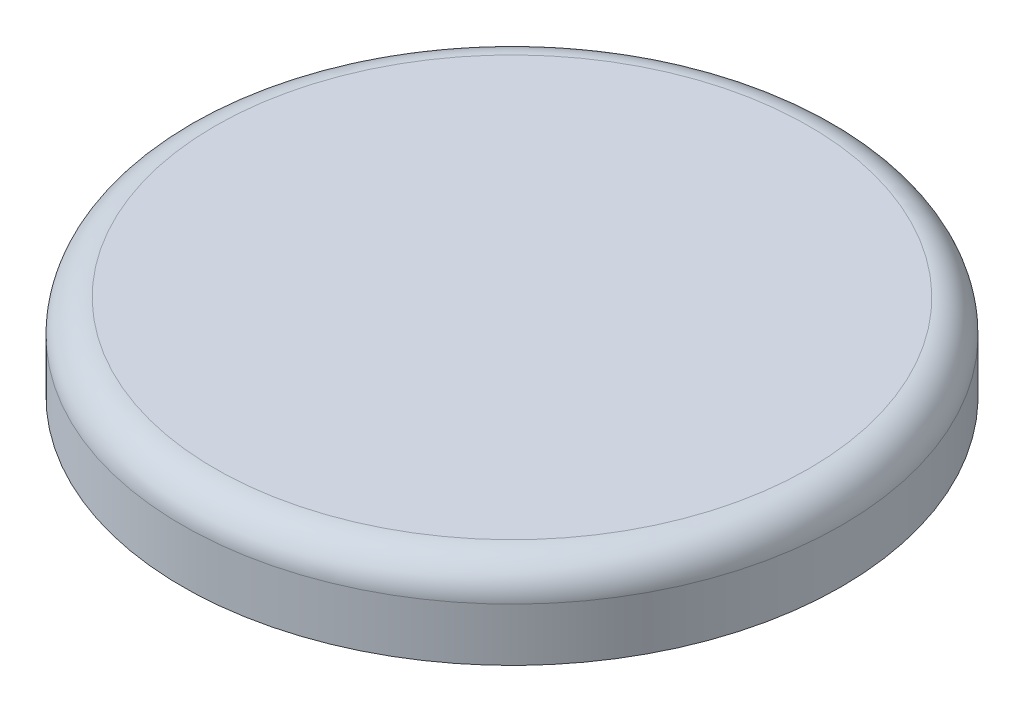
ISO-10303-21;
HEADER;
FILE_DESCRIPTION(('STEP AP214'),'2;1');
FILE_NAME('part.step','',(''),(''),'','','');
FILE_SCHEMA(('AUTOMOTIVE_DESIGN { 1 0 10303 214 1 1 1 1 }'));
ENDSEC;
DATA;
#1=APPLICATION_CONTEXT('core data for automotive mechanical design processes');
#2=APPLICATION_PROTOCOL_DEFINITION('international standard','automotive_design',2000,#1);
#3=PRODUCT_CONTEXT('',#1,'mechanical');
#4=PRODUCT('Part','Part','',(#3));
#5=PRODUCT_RELATED_PRODUCT_CATEGORY('part','',(#4));
#6=PRODUCT_DEFINITION_FORMATION('','',#4);
#7=PRODUCT_DEFINITION_CONTEXT('part definition',#1,'design');
#8=PRODUCT_DEFINITION('design','',#6,#7);
#9=PRODUCT_DEFINITION_SHAPE('','',#8);
#10=(LENGTH_UNIT() NAMED_UNIT(*) SI_UNIT(.MILLI.,.METRE.));
#11=(NAMED_UNIT(*) PLANE_ANGLE_UNIT() SI_UNIT($,.RADIAN.));
#12=(NAMED_UNIT(*) SI_UNIT($,.STERADIAN.) SOLID_ANGLE_UNIT());
#13=UNCERTAINTY_MEASURE_WITH_UNIT(LENGTH_MEASURE(1.E-05),#10,'distance_accuracy_value','');
#14=(GEOMETRIC_REPRESENTATION_CONTEXT(3) GLOBAL_UNCERTAINTY_ASSIGNED_CONTEXT((#13)) GLOBAL_UNIT_ASSIGNED_CONTEXT((#10,
#11,#12)) REPRESENTATION_CONTEXT('',''));
#15=CARTESIAN_POINT('',(0.,0.,0.));
#16=DIRECTION('',(0.,0.,1.));
#17=DIRECTION('',(1.,0.,0.));
#18=AXIS2_PLACEMENT_3D('',#15,#16,#17);
#19=CARTESIAN_POINT('',(7.20725,-1.5875,0.));
#20=DIRECTION('',(0.,-1.,0.));
#21=DIRECTION('',(0.,0.,-1.));
#22=AXIS2_PLACEMENT_3D('',#19,#20,#21);
#23=PLANE('',#22);
#24=CARTESIAN_POINT('',(0.,-1.5875,0.));
#25=DIRECTION('',(0.,-1.,0.));
#26=DIRECTION('',(1.,0.,0.));
#27=AXIS2_PLACEMENT_3D('',#24,#25,#26);
#28=CIRCLE('',#27,14.4145);
#29=CARTESIAN_POINT('',(14.4145,-1.5875,0.));
#30=VERTEX_POINT('',#29);
#31=EDGE_CURVE('E11',#30,#30,#28,.T.);
#32=ORIENTED_EDGE('',*,*,#31,.T.);
#33=EDGE_LOOP('',(#32));
#34=FACE_BOUND('',#33,.T.);
#35=ADVANCED_FACE('F16',(#34),#23,.T.);
#36=CARTESIAN_POINT('',(0.,-2.87655,0.));
#37=DIRECTION('',(0.,-1.,0.));
#38=DIRECTION('',(1.,0.,0.));
#39=AXIS2_PLACEMENT_3D('',#36,#37,#38);
#40=CYLINDRICAL_SURFACE('',#39,14.4145);
#41=CARTESIAN_POINT('',(0.,-4.1656,0.));
#42=DIRECTION('',(0.,-1.,0.));
#43=DIRECTION('',(1.,0.,0.));
#44=AXIS2_PLACEMENT_3D('',#41,#42,#43);
#45=CIRCLE('',#44,14.4145);
#46=CARTESIAN_POINT('',(14.4145,-4.1656,0.));
#47=VERTEX_POINT('',#46);
#48=EDGE_CURVE('E26',#47,#47,#45,.T.);
#49=ORIENTED_EDGE('',*,*,#48,.T.);
#50=EDGE_LOOP('',(#49));
#51=FACE_BOUND('',#50,.T.);
#52=ORIENTED_EDGE('',*,*,#31,.F.);
#53=EDGE_LOOP('',(#52));
#54=FACE_BOUND('',#53,.T.);
#55=ADVANCED_FACE('F104',(#51,#54),#40,.F.);
#56=CARTESIAN_POINT('',(15.20825,-4.1656,0.));
#57=DIRECTION('',(0.,-1.,0.));
#58=DIRECTION('',(0.,0.,-1.));
#59=AXIS2_PLACEMENT_3D('',#56,#57,#58);
#60=PLANE('',#59);
#61=ORIENTED_EDGE('',*,*,#48,.F.);
#62=EDGE_LOOP('',(#61));
#63=FACE_BOUND('',#62,.T.);
#64=CARTESIAN_POINT('',(0.,-4.1656,0.));
#65=DIRECTION('',(0.,-1.,0.));
#66=DIRECTION('',(1.,0.,0.));
#67=AXIS2_PLACEMENT_3D('',#64,#65,#66);
#68=CIRCLE('',#67,16.002);
#69=CARTESIAN_POINT('',(16.002,-4.1656,0.));
#70=VERTEX_POINT('',#69);
#71=EDGE_CURVE('E59',#70,#70,#68,.T.);
#72=ORIENTED_EDGE('',*,*,#71,.T.);
#73=EDGE_LOOP('',(#72));
#74=FACE_BOUND('',#73,.T.);
#75=ADVANCED_FACE('F60',(#63,#74),#60,.T.);
#76=CARTESIAN_POINT('',(8.001,0.,0.));
#77=DIRECTION('',(0.,1.,0.));
#78=DIRECTION('',(1.,0.,0.));
#79=AXIS2_PLACEMENT_3D('',#76,#77,#78);
#80=PLANE('',#79);
#81=CARTESIAN_POINT('',(0.,0.,0.));
#82=DIRECTION('',(0.,-1.,0.));
#83=DIRECTION('',(-1.,0.,0.));
#84=AXIS2_PLACEMENT_3D('',#81,#82,#83);
#85=CIRCLE('',#84,14.4145);
#86=CARTESIAN_POINT('',(14.4145,0.,0.));
#87=VERTEX_POINT('',#86);
#88=EDGE_CURVE('E47',#87,#87,#85,.T.);
#89=ORIENTED_EDGE('',*,*,#88,.F.);
#90=EDGE_LOOP('',(#89));
#91=FACE_BOUND('',#90,.T.);
#92=ADVANCED_FACE('F90',(#91),#80,.T.);
#93=CARTESIAN_POINT('',(0.,-2.0828,0.));
#94=DIRECTION('',(0.,-1.,0.));
#95=DIRECTION('',(1.,0.,0.));
#96=AXIS2_PLACEMENT_3D('',#93,#94,#95);
#97=CYLINDRICAL_SURFACE('',#96,16.002);
#98=CARTESIAN_POINT('',(0.,-1.5875,0.));
#99=DIRECTION('',(0.,1.,0.));
#100=DIRECTION('',(-1.,0.,0.));
#101=AXIS2_PLACEMENT_3D('',#98,#99,#100);
#102=CIRCLE('',#101,16.002);
#103=CARTESIAN_POINT('',(16.002,-1.5875,0.));
#104=VERTEX_POINT('',#103);
#105=EDGE_CURVE('E53',#104,#104,#102,.T.);
#106=ORIENTED_EDGE('',*,*,#105,.F.);
#107=EDGE_LOOP('',(#106));
#108=FACE_BOUND('',#107,.T.);
#109=ORIENTED_EDGE('',*,*,#71,.F.);
#110=EDGE_LOOP('',(#109));
#111=FACE_BOUND('',#110,.T.);
#112=ADVANCED_FACE('F18',(#108,#111),#97,.T.);
#113=CARTESIAN_POINT('',(0.,-1.5875,0.));
#114=DIRECTION('',(0.,-1.,0.));
#115=DIRECTION('',(0.,0.,-1.));
#116=AXIS2_PLACEMENT_3D('',#113,#114,#115);
#117=TOROIDAL_SURFACE('',#116,14.4145,1.5875);
#118=ORIENTED_EDGE('',*,*,#105,.T.);
#119=EDGE_LOOP('',(#118));
#120=FACE_BOUND('',#119,.T.);
#121=ORIENTED_EDGE('',*,*,#88,.T.);
#122=EDGE_LOOP('',(#121));
#123=FACE_BOUND('',#122,.T.);
#124=ADVANCED_FACE('F118',(#120,#123),#117,.T.);
#125=CLOSED_SHELL('',(#35,#55,#75,#92,#112,#124));
#126=MANIFOLD_SOLID_BREP('B1',#125);
#127=ADVANCED_BREP_SHAPE_REPRESENTATION('',(#18,#126),#14);
#128=SHAPE_DEFINITION_REPRESENTATION(#9,#127);
ENDSEC;
END-ISO-10303-21;
